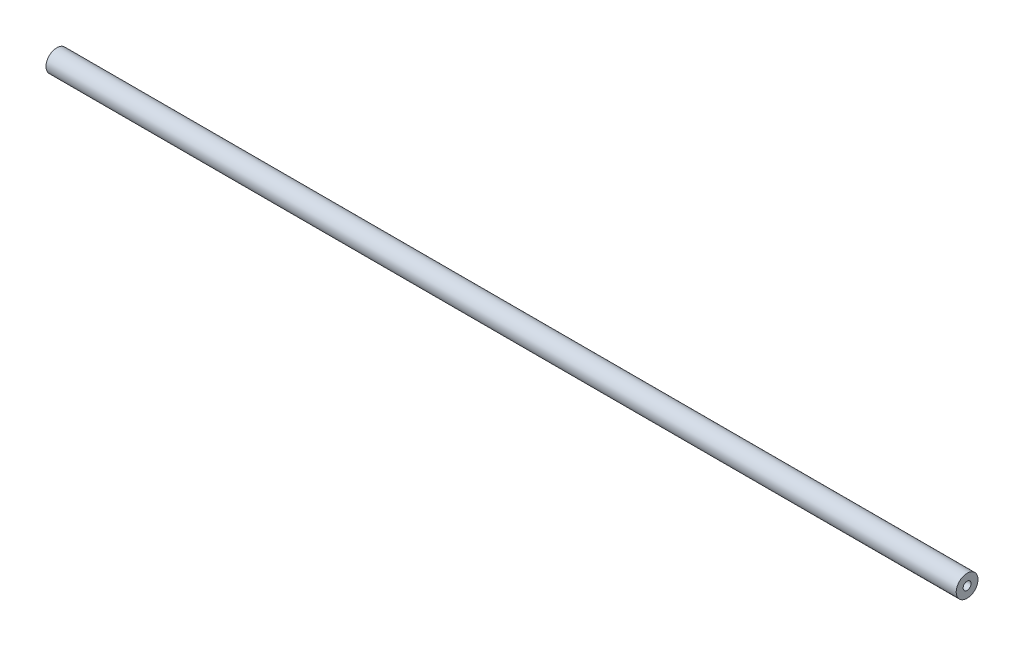
ISO-10303-21;
HEADER;
FILE_DESCRIPTION(('STEP AP214'),'2;1');
FILE_NAME('part.step','',(''),(''),'','','');
FILE_SCHEMA(('AUTOMOTIVE_DESIGN { 1 0 10303 214 1 1 1 1 }'));
ENDSEC;
DATA;
#1=APPLICATION_CONTEXT('core data for automotive mechanical design processes');
#2=APPLICATION_PROTOCOL_DEFINITION('international standard','automotive_design',2000,#1);
#3=PRODUCT_CONTEXT('',#1,'mechanical');
#4=PRODUCT('Part','Part','',(#3));
#5=PRODUCT_RELATED_PRODUCT_CATEGORY('part','',(#4));
#6=PRODUCT_DEFINITION_FORMATION('','',#4);
#7=PRODUCT_DEFINITION_CONTEXT('part definition',#1,'design');
#8=PRODUCT_DEFINITION('design','',#6,#7);
#9=PRODUCT_DEFINITION_SHAPE('','',#8);
#10=(LENGTH_UNIT() NAMED_UNIT(*) SI_UNIT(.MILLI.,.METRE.));
#11=(NAMED_UNIT(*) PLANE_ANGLE_UNIT() SI_UNIT($,.RADIAN.));
#12=(NAMED_UNIT(*) SI_UNIT($,.STERADIAN.) SOLID_ANGLE_UNIT());
#13=UNCERTAINTY_MEASURE_WITH_UNIT(LENGTH_MEASURE(1.E-05),#10,'distance_accuracy_value','');
#14=(GEOMETRIC_REPRESENTATION_CONTEXT(3) GLOBAL_UNCERTAINTY_ASSIGNED_CONTEXT((#13)) GLOBAL_UNIT_ASSIGNED_CONTEXT((#10,
#11,#12)) REPRESENTATION_CONTEXT('',''));
#15=CARTESIAN_POINT('',(0.,0.,0.));
#16=DIRECTION('',(0.,0.,1.));
#17=DIRECTION('',(1.,0.,0.));
#18=AXIS2_PLACEMENT_3D('',#15,#16,#17);
#19=CARTESIAN_POINT('',(376.,0.,0.));
#20=DIRECTION('',(1.,0.,0.));
#21=DIRECTION('',(0.,0.,-1.));
#22=AXIS2_PLACEMENT_3D('',#19,#20,#21);
#23=PLANE('',#22);
#24=CARTESIAN_POINT('',(376.,0.,0.));
#25=DIRECTION('',(1.,0.,0.));
#26=DIRECTION('',(0.,0.,-1.));
#27=AXIS2_PLACEMENT_3D('',#24,#25,#26);
#28=CIRCLE('',#27,4.5);
#29=CARTESIAN_POINT('',(376.,0.,-4.5));
#30=VERTEX_POINT('',#29);
#31=EDGE_CURVE('E10',#30,#30,#28,.T.);
#32=ORIENTED_EDGE('',*,*,#31,.T.);
#33=EDGE_LOOP('',(#32));
#34=FACE_BOUND('',#33,.T.);
#35=CARTESIAN_POINT('',(376.,0.,0.));
#36=DIRECTION('',(1.,0.,0.));
#37=DIRECTION('',(0.,0.,-1.));
#38=AXIS2_PLACEMENT_3D('',#35,#36,#37);
#39=CIRCLE('',#38,1.65);
#40=CARTESIAN_POINT('',(376.,0.,-1.65));
#41=VERTEX_POINT('',#40);
#42=EDGE_CURVE('E52',#41,#41,#39,.T.);
#43=ORIENTED_EDGE('',*,*,#42,.F.);
#44=EDGE_LOOP('',(#43));
#45=FACE_BOUND('',#44,.T.);
#46=ADVANCED_FACE('F41',(#34,#45),#23,.T.);
#47=CARTESIAN_POINT('',(0.,0.,0.));
#48=DIRECTION('',(1.,0.,0.));
#49=DIRECTION('',(0.,0.,-1.));
#50=AXIS2_PLACEMENT_3D('',#47,#48,#49);
#51=PLANE('',#50);
#52=CARTESIAN_POINT('',(0.,0.,0.));
#53=DIRECTION('',(1.,0.,0.));
#54=DIRECTION('',(0.,0.,-1.));
#55=AXIS2_PLACEMENT_3D('',#52,#53,#54);
#56=CIRCLE('',#55,4.5);
#57=CARTESIAN_POINT('',(0.,0.,-4.5));
#58=VERTEX_POINT('',#57);
#59=EDGE_CURVE('E45',#58,#58,#56,.T.);
#60=ORIENTED_EDGE('',*,*,#59,.F.);
#61=EDGE_LOOP('',(#60));
#62=FACE_BOUND('',#61,.T.);
#63=CARTESIAN_POINT('',(0.,0.,0.));
#64=DIRECTION('',(1.,0.,0.));
#65=DIRECTION('',(0.,0.,-1.));
#66=AXIS2_PLACEMENT_3D('',#63,#64,#65);
#67=CIRCLE('',#66,1.65);
#68=CARTESIAN_POINT('',(0.,0.,-1.65));
#69=VERTEX_POINT('',#68);
#70=EDGE_CURVE('E54',#69,#69,#67,.T.);
#71=ORIENTED_EDGE('',*,*,#70,.T.);
#72=EDGE_LOOP('',(#71));
#73=FACE_BOUND('',#72,.T.);
#74=ADVANCED_FACE('F64',(#62,#73),#51,.F.);
#75=CARTESIAN_POINT('',(376.,0.,0.));
#76=DIRECTION('',(-1.,0.,0.));
#77=DIRECTION('',(0.,0.,1.));
#78=AXIS2_PLACEMENT_3D('',#75,#76,#77);
#79=CYLINDRICAL_SURFACE('',#78,4.5);
#80=ORIENTED_EDGE('',*,*,#31,.F.);
#81=EDGE_LOOP('',(#80));
#82=FACE_BOUND('',#81,.T.);
#83=ORIENTED_EDGE('',*,*,#59,.T.);
#84=EDGE_LOOP('',(#83));
#85=FACE_BOUND('',#84,.T.);
#86=ADVANCED_FACE('F43',(#82,#85),#79,.T.);
#87=CARTESIAN_POINT('',(376.,0.,0.));
#88=DIRECTION('',(-1.,0.,0.));
#89=DIRECTION('',(0.,0.,1.));
#90=AXIS2_PLACEMENT_3D('',#87,#88,#89);
#91=CYLINDRICAL_SURFACE('',#90,1.65);
#92=ORIENTED_EDGE('',*,*,#42,.T.);
#93=EDGE_LOOP('',(#92));
#94=FACE_BOUND('',#93,.T.);
#95=ORIENTED_EDGE('',*,*,#70,.F.);
#96=EDGE_LOOP('',(#95));
#97=FACE_BOUND('',#96,.T.);
#98=ADVANCED_FACE('F60',(#94,#97),#91,.F.);
#99=CLOSED_SHELL('',(#46,#74,#86,#98));
#100=MANIFOLD_SOLID_BREP('B2',#99);
#101=ADVANCED_BREP_SHAPE_REPRESENTATION('',(#18,#100),#14);
#102=SHAPE_DEFINITION_REPRESENTATION(#9,#101);
ENDSEC;
END-ISO-10303-21;
